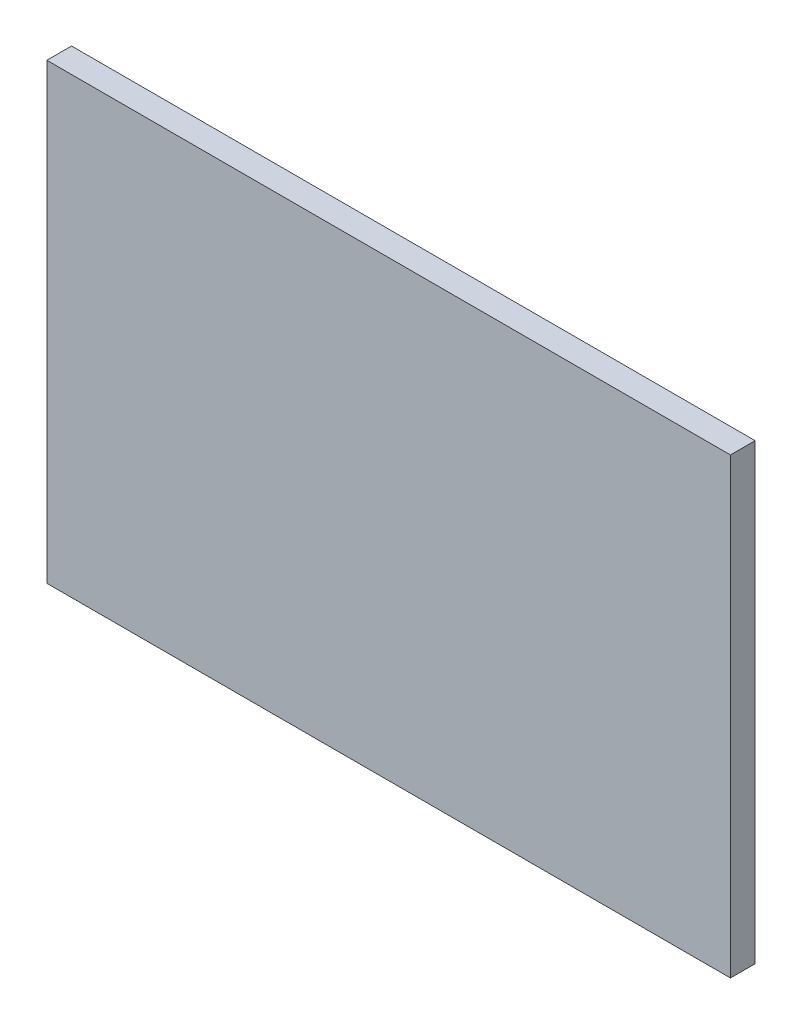
ISO-10303-21;
HEADER;
FILE_DESCRIPTION(('STEP AP214'),'2;1');
FILE_NAME('part.step','',(''),(''),'','','');
FILE_SCHEMA(('AUTOMOTIVE_DESIGN { 1 0 10303 214 1 1 1 1 }'));
ENDSEC;
DATA;
#1=APPLICATION_CONTEXT('core data for automotive mechanical design processes');
#2=APPLICATION_PROTOCOL_DEFINITION('international standard','automotive_design',2000,#1);
#3=PRODUCT_CONTEXT('',#1,'mechanical');
#4=PRODUCT('Part','Part','',(#3));
#5=PRODUCT_RELATED_PRODUCT_CATEGORY('part','',(#4));
#6=PRODUCT_DEFINITION_FORMATION('','',#4);
#7=PRODUCT_DEFINITION_CONTEXT('part definition',#1,'design');
#8=PRODUCT_DEFINITION('design','',#6,#7);
#9=PRODUCT_DEFINITION_SHAPE('','',#8);
#10=(LENGTH_UNIT() NAMED_UNIT(*) SI_UNIT(.MILLI.,.METRE.));
#11=(NAMED_UNIT(*) PLANE_ANGLE_UNIT() SI_UNIT($,.RADIAN.));
#12=(NAMED_UNIT(*) SI_UNIT($,.STERADIAN.) SOLID_ANGLE_UNIT());
#13=UNCERTAINTY_MEASURE_WITH_UNIT(LENGTH_MEASURE(1.E-05),#10,'distance_accuracy_value','');
#14=(GEOMETRIC_REPRESENTATION_CONTEXT(3) GLOBAL_UNCERTAINTY_ASSIGNED_CONTEXT((#13)) GLOBAL_UNIT_ASSIGNED_CONTEXT((#10,
#11,#12)) REPRESENTATION_CONTEXT('',''));
#15=CARTESIAN_POINT('',(0.,0.,0.));
#16=DIRECTION('',(0.,0.,1.));
#17=DIRECTION('',(1.,0.,0.));
#18=AXIS2_PLACEMENT_3D('',#15,#16,#17);
#19=CARTESIAN_POINT('',(0.,0.,3.));
#20=DIRECTION('',(1.,0.,0.));
#21=DIRECTION('',(0.,1.,0.));
#22=AXIS2_PLACEMENT_3D('',#19,#20,#21);
#23=PLANE('',#22);
#24=DIRECTION('',(0.,-1.,0.));
#25=VECTOR('',#24,1.);
#26=CARTESIAN_POINT('',(0.,0.,0.));
#27=LINE('',#26,#25);
#28=CARTESIAN_POINT('',(0.,55.,0.));
#29=VERTEX_POINT('',#28);
#30=CARTESIAN_POINT('',(0.,0.,0.));
#31=VERTEX_POINT('',#30);
#32=EDGE_CURVE('E97',#29,#31,#27,.T.);
#33=ORIENTED_EDGE('',*,*,#32,.T.);
#34=DIRECTION('',(0.,0.,-1.));
#35=VECTOR('',#34,1.);
#36=CARTESIAN_POINT('',(0.,0.,3.));
#37=LINE('',#36,#35);
#38=CARTESIAN_POINT('',(0.,0.,3.));
#39=VERTEX_POINT('',#38);
#40=EDGE_CURVE('E11',#39,#31,#37,.T.);
#41=ORIENTED_EDGE('',*,*,#40,.F.);
#42=DIRECTION('',(0.,-1.,0.));
#43=VECTOR('',#42,1.);
#44=CARTESIAN_POINT('',(0.,0.,3.));
#45=LINE('',#44,#43);
#46=CARTESIAN_POINT('',(0.,55.,3.));
#47=VERTEX_POINT('',#46);
#48=EDGE_CURVE('E85',#47,#39,#45,.T.);
#49=ORIENTED_EDGE('',*,*,#48,.F.);
#50=DIRECTION('',(0.,0.,-1.));
#51=VECTOR('',#50,1.);
#52=CARTESIAN_POINT('',(0.,55.,3.));
#53=LINE('',#52,#51);
#54=EDGE_CURVE('E93',#47,#29,#53,.T.);
#55=ORIENTED_EDGE('',*,*,#54,.T.);
#56=EDGE_LOOP('',(#33,#41,#49,#55));
#57=FACE_BOUND('',#56,.T.);
#58=ADVANCED_FACE('F34',(#57),#23,.F.);
#59=CARTESIAN_POINT('',(0.,0.,3.));
#60=DIRECTION('',(0.,1.,0.));
#61=DIRECTION('',(0.,0.,1.));
#62=AXIS2_PLACEMENT_3D('',#59,#60,#61);
#63=PLANE('',#62);
#64=DIRECTION('',(1.,0.,0.));
#65=VECTOR('',#64,1.);
#66=CARTESIAN_POINT('',(0.,0.,0.));
#67=LINE('',#66,#65);
#68=CARTESIAN_POINT('',(83.,0.,0.));
#69=VERTEX_POINT('',#68);
#70=EDGE_CURVE('E89',#31,#69,#67,.T.);
#71=ORIENTED_EDGE('',*,*,#70,.T.);
#72=DIRECTION('',(0.,0.,-1.));
#73=VECTOR('',#72,1.);
#74=CARTESIAN_POINT('',(83.,0.,3.));
#75=LINE('',#74,#73);
#76=CARTESIAN_POINT('',(83.,0.,3.));
#77=VERTEX_POINT('',#76);
#78=EDGE_CURVE('E42',#77,#69,#75,.T.);
#79=ORIENTED_EDGE('',*,*,#78,.F.);
#80=DIRECTION('',(1.,0.,0.));
#81=VECTOR('',#80,1.);
#82=CARTESIAN_POINT('',(0.,0.,3.));
#83=LINE('',#82,#81);
#84=EDGE_CURVE('E80',#39,#77,#83,.T.);
#85=ORIENTED_EDGE('',*,*,#84,.F.);
#86=ORIENTED_EDGE('',*,*,#40,.T.);
#87=EDGE_LOOP('',(#71,#79,#85,#86));
#88=FACE_BOUND('',#87,.T.);
#89=ADVANCED_FACE('F88',(#88),#63,.F.);
#90=CARTESIAN_POINT('',(83.,0.,3.));
#91=DIRECTION('',(-1.,0.,0.));
#92=DIRECTION('',(0.,-1.,0.));
#93=AXIS2_PLACEMENT_3D('',#90,#91,#92);
#94=PLANE('',#93);
#95=DIRECTION('',(0.,1.,0.));
#96=VECTOR('',#95,1.);
#97=CARTESIAN_POINT('',(83.,0.,0.));
#98=LINE('',#97,#96);
#99=CARTESIAN_POINT('',(83.,55.,0.));
#100=VERTEX_POINT('',#99);
#101=EDGE_CURVE('E67',#69,#100,#98,.T.);
#102=ORIENTED_EDGE('',*,*,#101,.T.);
#103=DIRECTION('',(0.,0.,-1.));
#104=VECTOR('',#103,1.);
#105=CARTESIAN_POINT('',(83.,55.,3.));
#106=LINE('',#105,#104);
#107=CARTESIAN_POINT('',(83.,55.,3.));
#108=VERTEX_POINT('',#107);
#109=EDGE_CURVE('E90',#108,#100,#106,.T.);
#110=ORIENTED_EDGE('',*,*,#109,.F.);
#111=DIRECTION('',(0.,1.,0.));
#112=VECTOR('',#111,1.);
#113=CARTESIAN_POINT('',(83.,0.,3.));
#114=LINE('',#113,#112);
#115=EDGE_CURVE('E83',#77,#108,#114,.T.);
#116=ORIENTED_EDGE('',*,*,#115,.F.);
#117=ORIENTED_EDGE('',*,*,#78,.T.);
#118=EDGE_LOOP('',(#102,#110,#116,#117));
#119=FACE_BOUND('',#118,.T.);
#120=ADVANCED_FACE('F91',(#119),#94,.F.);
#121=CARTESIAN_POINT('',(0.,55.,3.));
#122=DIRECTION('',(0.,-1.,0.));
#123=DIRECTION('',(0.,0.,-1.));
#124=AXIS2_PLACEMENT_3D('',#121,#122,#123);
#125=PLANE('',#124);
#126=DIRECTION('',(-1.,0.,0.));
#127=VECTOR('',#126,1.);
#128=CARTESIAN_POINT('',(0.,55.,0.));
#129=LINE('',#128,#127);
#130=EDGE_CURVE('E73',#100,#29,#129,.T.);
#131=ORIENTED_EDGE('',*,*,#130,.T.);
#132=ORIENTED_EDGE('',*,*,#54,.F.);
#133=DIRECTION('',(-1.,0.,0.));
#134=VECTOR('',#133,1.);
#135=CARTESIAN_POINT('',(0.,55.,3.));
#136=LINE('',#135,#134);
#137=EDGE_CURVE('E50',#108,#47,#136,.T.);
#138=ORIENTED_EDGE('',*,*,#137,.F.);
#139=ORIENTED_EDGE('',*,*,#109,.T.);
#140=EDGE_LOOP('',(#131,#132,#138,#139));
#141=FACE_BOUND('',#140,.T.);
#142=ADVANCED_FACE('F104',(#141),#125,.F.);
#143=CARTESIAN_POINT('',(0.,0.,3.));
#144=DIRECTION('',(0.,0.,-1.));
#145=DIRECTION('',(-1.,0.,0.));
#146=AXIS2_PLACEMENT_3D('',#143,#144,#145);
#147=PLANE('',#146);
#148=ORIENTED_EDGE('',*,*,#48,.T.);
#149=ORIENTED_EDGE('',*,*,#84,.T.);
#150=ORIENTED_EDGE('',*,*,#115,.T.);
#151=ORIENTED_EDGE('',*,*,#137,.T.);
#152=EDGE_LOOP('',(#148,#149,#150,#151));
#153=FACE_BOUND('',#152,.T.);
#154=ADVANCED_FACE('F81',(#153),#147,.F.);
#155=CARTESIAN_POINT('',(0.,0.,0.));
#156=DIRECTION('',(0.,0.,-1.));
#157=DIRECTION('',(-1.,0.,0.));
#158=AXIS2_PLACEMENT_3D('',#155,#156,#157);
#159=PLANE('',#158);
#160=ORIENTED_EDGE('',*,*,#32,.F.);
#161=ORIENTED_EDGE('',*,*,#130,.F.);
#162=ORIENTED_EDGE('',*,*,#101,.F.);
#163=ORIENTED_EDGE('',*,*,#70,.F.);
#164=EDGE_LOOP('',(#160,#161,#162,#163));
#165=FACE_BOUND('',#164,.T.);
#166=ADVANCED_FACE('F107',(#165),#159,.T.);
#167=CLOSED_SHELL('',(#58,#89,#120,#142,#154,#166));
#168=MANIFOLD_SOLID_BREP('B2',#167);
#169=ADVANCED_BREP_SHAPE_REPRESENTATION('',(#18,#168),#14);
#170=SHAPE_DEFINITION_REPRESENTATION(#9,#169);
ENDSEC;
END-ISO-10303-21;
